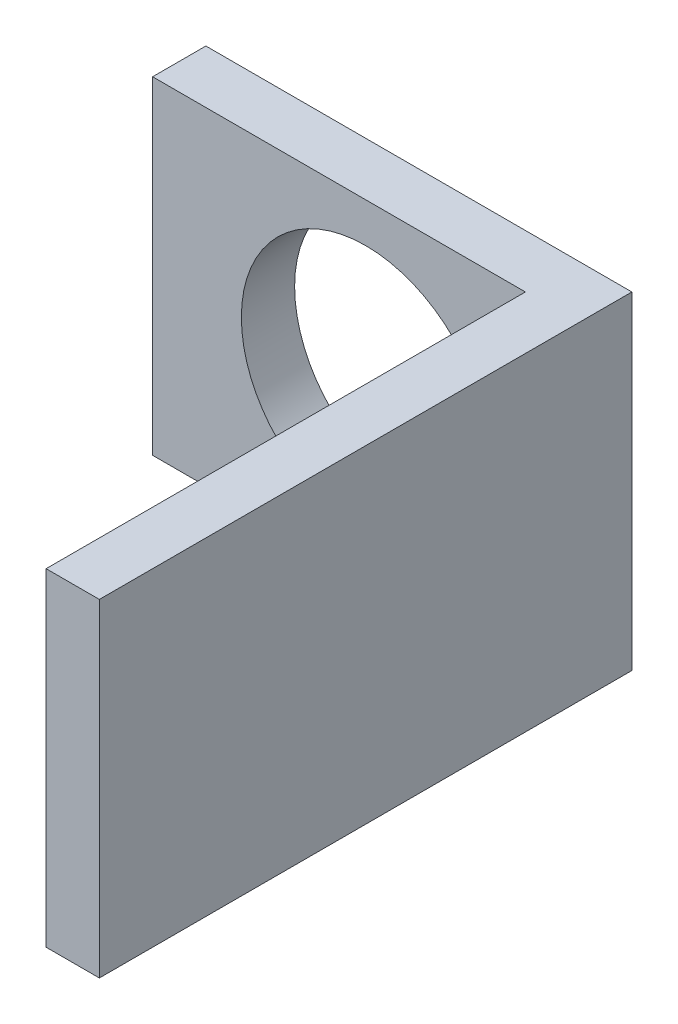
ISO-10303-21;
HEADER;
FILE_DESCRIPTION(('STEP AP214'),'2;1');
FILE_NAME('part.step','',(''),(''),'','','');
FILE_SCHEMA(('AUTOMOTIVE_DESIGN { 1 0 10303 214 1 1 1 1 }'));
ENDSEC;
DATA;
#1=APPLICATION_CONTEXT('core data for automotive mechanical design processes');
#2=APPLICATION_PROTOCOL_DEFINITION('international standard','automotive_design',2000,#1);
#3=PRODUCT_CONTEXT('',#1,'mechanical');
#4=PRODUCT('Part','Part','',(#3));
#5=PRODUCT_RELATED_PRODUCT_CATEGORY('part','',(#4));
#6=PRODUCT_DEFINITION_FORMATION('','',#4);
#7=PRODUCT_DEFINITION_CONTEXT('part definition',#1,'design');
#8=PRODUCT_DEFINITION('design','',#6,#7);
#9=PRODUCT_DEFINITION_SHAPE('','',#8);
#10=(LENGTH_UNIT() NAMED_UNIT(*) SI_UNIT(.MILLI.,.METRE.));
#11=(NAMED_UNIT(*) PLANE_ANGLE_UNIT() SI_UNIT($,.RADIAN.));
#12=(NAMED_UNIT(*) SI_UNIT($,.STERADIAN.) SOLID_ANGLE_UNIT());
#13=UNCERTAINTY_MEASURE_WITH_UNIT(LENGTH_MEASURE(1.E-05),#10,'distance_accuracy_value','');
#14=(GEOMETRIC_REPRESENTATION_CONTEXT(3) GLOBAL_UNCERTAINTY_ASSIGNED_CONTEXT((#13)) GLOBAL_UNIT_ASSIGNED_CONTEXT((#10,
#11,#12)) REPRESENTATION_CONTEXT('',''));
#15=CARTESIAN_POINT('',(0.,0.,0.));
#16=DIRECTION('',(0.,0.,1.));
#17=DIRECTION('',(1.,0.,0.));
#18=AXIS2_PLACEMENT_3D('',#15,#16,#17);
#19=CARTESIAN_POINT('',(0.,4.61769896716416,1.5));
#20=DIRECTION('',(0.,1.,0.));
#21=DIRECTION('',(0.,0.,1.));
#22=AXIS2_PLACEMENT_3D('',#19,#20,#21);
#23=PLANE('',#22);
#24=DIRECTION('',(1.,0.,0.));
#25=VECTOR('',#24,1.);
#26=CARTESIAN_POINT('',(0.,4.61769896716416,0.));
#27=LINE('',#26,#25);
#28=CARTESIAN_POINT('',(-6.,4.61769896716416,0.));
#29=VERTEX_POINT('',#28);
#30=CARTESIAN_POINT('',(6.,4.61769896716416,0.));
#31=VERTEX_POINT('',#30);
#32=EDGE_CURVE('E81',#29,#31,#27,.T.);
#33=ORIENTED_EDGE('',*,*,#32,.F.);
#34=DIRECTION('',(0.,0.,-1.));
#35=VECTOR('',#34,1.);
#36=CARTESIAN_POINT('',(-6.,4.61769896716416,1.5));
#37=LINE('',#36,#35);
#38=CARTESIAN_POINT('',(-6.,4.61769896716416,1.5));
#39=VERTEX_POINT('',#38);
#40=EDGE_CURVE('E11',#39,#29,#37,.T.);
#41=ORIENTED_EDGE('',*,*,#40,.F.);
#42=DIRECTION('',(1.,0.,0.));
#43=VECTOR('',#42,1.);
#44=CARTESIAN_POINT('',(0.,4.61769896716416,1.5));
#45=LINE('',#44,#43);
#46=CARTESIAN_POINT('',(4.5,4.61769896716416,1.5));
#47=VERTEX_POINT('',#46);
#48=EDGE_CURVE('E52',#39,#47,#45,.T.);
#49=ORIENTED_EDGE('',*,*,#48,.T.);
#50=DIRECTION('',(0.,0.,-1.));
#51=VECTOR('',#50,1.);
#52=CARTESIAN_POINT('',(4.5,4.61769896716416,15.));
#53=LINE('',#52,#51);
#54=CARTESIAN_POINT('',(4.5,4.61769896716416,15.));
#55=VERTEX_POINT('',#54);
#56=EDGE_CURVE('E129',#55,#47,#53,.T.);
#57=ORIENTED_EDGE('',*,*,#56,.F.);
#58=DIRECTION('',(1.,0.,0.));
#59=VECTOR('',#58,1.);
#60=CARTESIAN_POINT('',(0.,4.61769896716416,15.));
#61=LINE('',#60,#59);
#62=CARTESIAN_POINT('',(6.,4.61769896716416,15.));
#63=VERTEX_POINT('',#62);
#64=EDGE_CURVE('E223',#55,#63,#61,.T.);
#65=ORIENTED_EDGE('',*,*,#64,.T.);
#66=DIRECTION('',(0.,0.,-1.));
#67=VECTOR('',#66,1.);
#68=CARTESIAN_POINT('',(6.,4.61769896716416,15.));
#69=LINE('',#68,#67);
#70=EDGE_CURVE('E127',#63,#31,#69,.T.);
#71=ORIENTED_EDGE('',*,*,#70,.T.);
#72=EDGE_LOOP('',(#33,#41,#49,#57,#65,#71));
#73=FACE_BOUND('',#72,.T.);
#74=ADVANCED_FACE('F35',(#73),#23,.T.);
#75=CARTESIAN_POINT('',(-6.,0.,1.5));
#76=DIRECTION('',(-1.,0.,0.));
#77=DIRECTION('',(0.,0.,1.));
#78=AXIS2_PLACEMENT_3D('',#75,#76,#77);
#79=PLANE('',#78);
#80=DIRECTION('',(0.,1.,0.));
#81=VECTOR('',#80,1.);
#82=CARTESIAN_POINT('',(-6.,0.,0.));
#83=LINE('',#82,#81);
#84=CARTESIAN_POINT('',(-6.,-4.61769896716416,0.));
#85=VERTEX_POINT('',#84);
#86=EDGE_CURVE('E100',#85,#29,#83,.T.);
#87=ORIENTED_EDGE('',*,*,#86,.F.);
#88=DIRECTION('',(0.,0.,-1.));
#89=VECTOR('',#88,1.);
#90=CARTESIAN_POINT('',(-6.,-4.61769896716416,1.5));
#91=LINE('',#90,#89);
#92=CARTESIAN_POINT('',(-6.,-4.61769896716416,1.5));
#93=VERTEX_POINT('',#92);
#94=EDGE_CURVE('E44',#93,#85,#91,.T.);
#95=ORIENTED_EDGE('',*,*,#94,.F.);
#96=DIRECTION('',(0.,1.,0.));
#97=VECTOR('',#96,1.);
#98=CARTESIAN_POINT('',(-6.,0.,1.5));
#99=LINE('',#98,#97);
#100=EDGE_CURVE('E84',#93,#39,#99,.T.);
#101=ORIENTED_EDGE('',*,*,#100,.T.);
#102=ORIENTED_EDGE('',*,*,#40,.T.);
#103=EDGE_LOOP('',(#87,#95,#101,#102));
#104=FACE_BOUND('',#103,.T.);
#105=ADVANCED_FACE('F89',(#104),#79,.T.);
#106=CARTESIAN_POINT('',(0.,-4.61769896716416,1.5));
#107=DIRECTION('',(0.,1.,0.));
#108=DIRECTION('',(0.,0.,1.));
#109=AXIS2_PLACEMENT_3D('',#106,#107,#108);
#110=PLANE('',#109);
#111=DIRECTION('',(1.,0.,0.));
#112=VECTOR('',#111,1.);
#113=CARTESIAN_POINT('',(0.,-4.61769896716416,0.));
#114=LINE('',#113,#112);
#115=CARTESIAN_POINT('',(6.,-4.61769896716416,0.));
#116=VERTEX_POINT('',#115);
#117=EDGE_CURVE('E102',#85,#116,#114,.T.);
#118=ORIENTED_EDGE('',*,*,#117,.T.);
#119=DIRECTION('',(0.,0.,-1.));
#120=VECTOR('',#119,1.);
#121=CARTESIAN_POINT('',(6.,-4.61769896716416,15.));
#122=LINE('',#121,#120);
#123=CARTESIAN_POINT('',(6.,-4.61769896716416,15.));
#124=VERTEX_POINT('',#123);
#125=EDGE_CURVE('E98',#124,#116,#122,.T.);
#126=ORIENTED_EDGE('',*,*,#125,.F.);
#127=DIRECTION('',(1.,0.,0.));
#128=VECTOR('',#127,1.);
#129=CARTESIAN_POINT('',(0.,-4.61769896716416,15.));
#130=LINE('',#129,#128);
#131=CARTESIAN_POINT('',(4.5,-4.61769896716416,15.));
#132=VERTEX_POINT('',#131);
#133=EDGE_CURVE('E118',#132,#124,#130,.T.);
#134=ORIENTED_EDGE('',*,*,#133,.F.);
#135=DIRECTION('',(0.,0.,-1.));
#136=VECTOR('',#135,1.);
#137=CARTESIAN_POINT('',(4.5,-4.61769896716416,15.));
#138=LINE('',#137,#136);
#139=CARTESIAN_POINT('',(4.5,-4.61769896716416,1.5));
#140=VERTEX_POINT('',#139);
#141=EDGE_CURVE('E228',#132,#140,#138,.T.);
#142=ORIENTED_EDGE('',*,*,#141,.T.);
#143=DIRECTION('',(1.,0.,0.));
#144=VECTOR('',#143,1.);
#145=CARTESIAN_POINT('',(0.,-4.61769896716416,1.5));
#146=LINE('',#145,#144);
#147=EDGE_CURVE('E71',#93,#140,#146,.T.);
#148=ORIENTED_EDGE('',*,*,#147,.F.);
#149=ORIENTED_EDGE('',*,*,#94,.T.);
#150=EDGE_LOOP('',(#118,#126,#134,#142,#148,#149));
#151=FACE_BOUND('',#150,.T.);
#152=ADVANCED_FACE('F106',(#151),#110,.F.);
#153=CARTESIAN_POINT('',(0.,0.,1.5));
#154=DIRECTION('',(0.,0.,-1.));
#155=DIRECTION('',(-1.,0.,0.));
#156=AXIS2_PLACEMENT_3D('',#153,#154,#155);
#157=CYLINDRICAL_SURFACE('',#156,3.5);
#158=CARTESIAN_POINT('',(0.,0.,1.5));
#159=DIRECTION('',(0.,0.,1.));
#160=DIRECTION('',(1.,0.,0.));
#161=AXIS2_PLACEMENT_3D('',#158,#159,#160);
#162=CIRCLE('',#161,3.5);
#163=CARTESIAN_POINT('',(3.5,0.,1.5));
#164=VERTEX_POINT('',#163);
#165=EDGE_CURVE('E87',#164,#164,#162,.T.);
#166=ORIENTED_EDGE('',*,*,#165,.T.);
#167=EDGE_LOOP('',(#166));
#168=FACE_BOUND('',#167,.T.);
#169=CARTESIAN_POINT('',(0.,0.,0.));
#170=DIRECTION('',(0.,0.,1.));
#171=DIRECTION('',(1.,0.,0.));
#172=AXIS2_PLACEMENT_3D('',#169,#170,#171);
#173=CIRCLE('',#172,3.5);
#174=CARTESIAN_POINT('',(3.5,0.,0.));
#175=VERTEX_POINT('',#174);
#176=EDGE_CURVE('E95',#175,#175,#173,.T.);
#177=ORIENTED_EDGE('',*,*,#176,.F.);
#178=EDGE_LOOP('',(#177));
#179=FACE_BOUND('',#178,.T.);
#180=ADVANCED_FACE('F37',(#168,#179),#157,.F.);
#181=CARTESIAN_POINT('',(0.,0.,1.5));
#182=DIRECTION('',(0.,0.,1.));
#183=DIRECTION('',(1.,0.,0.));
#184=AXIS2_PLACEMENT_3D('',#181,#182,#183);
#185=PLANE('',#184);
#186=ORIENTED_EDGE('',*,*,#165,.F.);
#187=EDGE_LOOP('',(#186));
#188=FACE_BOUND('',#187,.T.);
#189=ORIENTED_EDGE('',*,*,#48,.F.);
#190=ORIENTED_EDGE('',*,*,#100,.F.);
#191=ORIENTED_EDGE('',*,*,#147,.T.);
#192=DIRECTION('',(0.,-1.,0.));
#193=VECTOR('',#192,1.);
#194=CARTESIAN_POINT('',(4.5,0.,1.5));
#195=LINE('',#194,#193);
#196=EDGE_CURVE('E85',#47,#140,#195,.T.);
#197=ORIENTED_EDGE('',*,*,#196,.F.);
#198=EDGE_LOOP('',(#189,#190,#191,#197));
#199=FACE_BOUND('',#198,.T.);
#200=ADVANCED_FACE('F83',(#188,#199),#185,.T.);
#201=CARTESIAN_POINT('',(0.,0.,0.));
#202=DIRECTION('',(0.,0.,1.));
#203=DIRECTION('',(1.,0.,0.));
#204=AXIS2_PLACEMENT_3D('',#201,#202,#203);
#205=PLANE('',#204);
#206=ORIENTED_EDGE('',*,*,#176,.T.);
#207=EDGE_LOOP('',(#206));
#208=FACE_BOUND('',#207,.T.);
#209=ORIENTED_EDGE('',*,*,#32,.T.);
#210=DIRECTION('',(0.,1.,0.));
#211=VECTOR('',#210,1.);
#212=CARTESIAN_POINT('',(6.,0.,0.));
#213=LINE('',#212,#211);
#214=EDGE_CURVE('E114',#116,#31,#213,.T.);
#215=ORIENTED_EDGE('',*,*,#214,.F.);
#216=ORIENTED_EDGE('',*,*,#117,.F.);
#217=ORIENTED_EDGE('',*,*,#86,.T.);
#218=EDGE_LOOP('',(#209,#215,#216,#217));
#219=FACE_BOUND('',#218,.T.);
#220=ADVANCED_FACE('F112',(#208,#219),#205,.F.);
#221=CARTESIAN_POINT('',(4.5,0.,15.));
#222=DIRECTION('',(1.,0.,0.));
#223=DIRECTION('',(0.,1.,0.));
#224=AXIS2_PLACEMENT_3D('',#221,#222,#223);
#225=PLANE('',#224);
#226=ORIENTED_EDGE('',*,*,#56,.T.);
#227=ORIENTED_EDGE('',*,*,#196,.T.);
#228=ORIENTED_EDGE('',*,*,#141,.F.);
#229=DIRECTION('',(0.,-1.,0.));
#230=VECTOR('',#229,1.);
#231=CARTESIAN_POINT('',(4.5,0.,15.));
#232=LINE('',#231,#230);
#233=EDGE_CURVE('E219',#55,#132,#232,.T.);
#234=ORIENTED_EDGE('',*,*,#233,.F.);
#235=EDGE_LOOP('',(#226,#227,#228,#234));
#236=FACE_BOUND('',#235,.T.);
#237=ADVANCED_FACE('F143',(#236),#225,.F.);
#238=CARTESIAN_POINT('',(6.,0.,15.));
#239=DIRECTION('',(-1.,0.,0.));
#240=DIRECTION('',(0.,0.,1.));
#241=AXIS2_PLACEMENT_3D('',#238,#239,#240);
#242=PLANE('',#241);
#243=ORIENTED_EDGE('',*,*,#214,.T.);
#244=ORIENTED_EDGE('',*,*,#70,.F.);
#245=DIRECTION('',(0.,1.,0.));
#246=VECTOR('',#245,1.);
#247=CARTESIAN_POINT('',(6.,0.,15.));
#248=LINE('',#247,#246);
#249=EDGE_CURVE('E124',#124,#63,#248,.T.);
#250=ORIENTED_EDGE('',*,*,#249,.F.);
#251=ORIENTED_EDGE('',*,*,#125,.T.);
#252=EDGE_LOOP('',(#243,#244,#250,#251));
#253=FACE_BOUND('',#252,.T.);
#254=ADVANCED_FACE('F121',(#253),#242,.F.);
#255=CARTESIAN_POINT('',(0.,0.,15.));
#256=DIRECTION('',(0.,0.,1.));
#257=DIRECTION('',(1.,0.,0.));
#258=AXIS2_PLACEMENT_3D('',#255,#256,#257);
#259=PLANE('',#258);
#260=ORIENTED_EDGE('',*,*,#133,.T.);
#261=ORIENTED_EDGE('',*,*,#249,.T.);
#262=ORIENTED_EDGE('',*,*,#64,.F.);
#263=ORIENTED_EDGE('',*,*,#233,.T.);
#264=EDGE_LOOP('',(#260,#261,#262,#263));
#265=FACE_BOUND('',#264,.T.);
#266=ADVANCED_FACE('F203',(#265),#259,.T.);
#267=CLOSED_SHELL('',(#74,#105,#152,#180,#200,#220,#237,#254,#266));
#268=MANIFOLD_SOLID_BREP('B2',#267);
#269=ADVANCED_BREP_SHAPE_REPRESENTATION('',(#18,#268),#14);
#270=SHAPE_DEFINITION_REPRESENTATION(#9,#269);
ENDSEC;
END-ISO-10303-21;
